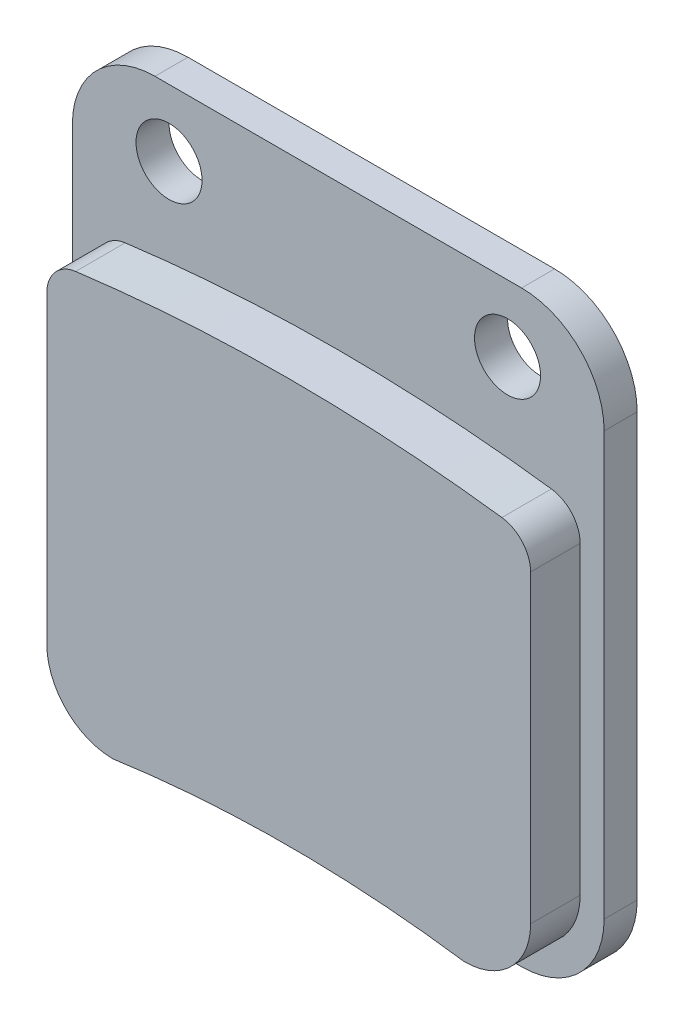
ISO-10303-21;
HEADER;
FILE_DESCRIPTION(('STEP AP214'),'2;1');
FILE_NAME('part.step','',(''),(''),'','','');
FILE_SCHEMA(('AUTOMOTIVE_DESIGN { 1 0 10303 214 1 1 1 1 }'));
ENDSEC;
DATA;
#1=APPLICATION_CONTEXT('core data for automotive mechanical design processes');
#2=APPLICATION_PROTOCOL_DEFINITION('international standard','automotive_design',2000,#1);
#3=PRODUCT_CONTEXT('',#1,'mechanical');
#4=PRODUCT('Part','Part','',(#3));
#5=PRODUCT_RELATED_PRODUCT_CATEGORY('part','',(#4));
#6=PRODUCT_DEFINITION_FORMATION('','',#4);
#7=PRODUCT_DEFINITION_CONTEXT('part definition',#1,'design');
#8=PRODUCT_DEFINITION('design','',#6,#7);
#9=PRODUCT_DEFINITION_SHAPE('','',#8);
#10=(LENGTH_UNIT() NAMED_UNIT(*) SI_UNIT(.MILLI.,.METRE.));
#11=(NAMED_UNIT(*) PLANE_ANGLE_UNIT() SI_UNIT($,.RADIAN.));
#12=(NAMED_UNIT(*) SI_UNIT($,.STERADIAN.) SOLID_ANGLE_UNIT());
#13=UNCERTAINTY_MEASURE_WITH_UNIT(LENGTH_MEASURE(1.E-05),#10,'distance_accuracy_value','');
#14=(GEOMETRIC_REPRESENTATION_CONTEXT(3) GLOBAL_UNCERTAINTY_ASSIGNED_CONTEXT((#13)) GLOBAL_UNIT_ASSIGNED_CONTEXT((#10,
#11,#12)) REPRESENTATION_CONTEXT('',''));
#15=CARTESIAN_POINT('',(0.,0.,0.));
#16=DIRECTION('',(0.,0.,1.));
#17=DIRECTION('',(1.,0.,0.));
#18=AXIS2_PLACEMENT_3D('',#15,#16,#17);
#19=CARTESIAN_POINT('',(-14.097,-16.256,2.54));
#20=DIRECTION('',(0.,0.,-1.));
#21=DIRECTION('',(-1.,0.,0.));
#22=AXIS2_PLACEMENT_3D('',#19,#20,#21);
#23=PLANE('',#22);
#24=CARTESIAN_POINT('',(-13.0175,17.4818046875046,2.54));
#25=DIRECTION('',(0.,0.,1.));
#26=DIRECTION('',(1.,0.,0.));
#27=AXIS2_PLACEMENT_3D('',#24,#25,#26);
#28=CIRCLE('',#27,2.54);
#29=CARTESIAN_POINT('',(-10.4775,17.4818046875046,2.54));
#30=VERTEX_POINT('',#29);
#31=EDGE_CURVE('E169',#30,#30,#28,.T.);
#32=ORIENTED_EDGE('',*,*,#31,.F.);
#33=EDGE_LOOP('',(#32));
#34=FACE_BOUND('',#33,.T.);
#35=CARTESIAN_POINT('',(-14.097,-16.256,2.54));
#36=DIRECTION('',(0.,0.,1.));
#37=DIRECTION('',(-1.,0.,0.));
#38=AXIS2_PLACEMENT_3D('',#35,#36,#37);
#39=CIRCLE('',#38,6.35);
#40=CARTESIAN_POINT('',(-20.447,-16.256,2.54));
#41=VERTEX_POINT('',#40);
#42=CARTESIAN_POINT('',(-14.0969999999999,-22.606,2.54));
#43=VERTEX_POINT('',#42);
#44=EDGE_CURVE('E184',#41,#43,#39,.T.);
#45=ORIENTED_EDGE('',*,*,#44,.T.);
#46=DIRECTION('',(1.,0.,0.));
#47=VECTOR('',#46,1.);
#48=CARTESIAN_POINT('',(-14.0969999999999,-22.606,2.54));
#49=LINE('',#48,#47);
#50=CARTESIAN_POINT('',(14.097,-22.606,2.54));
#51=VERTEX_POINT('',#50);
#52=EDGE_CURVE('E187',#43,#51,#49,.T.);
#53=ORIENTED_EDGE('',*,*,#52,.T.);
#54=CARTESIAN_POINT('',(14.097,-16.256,2.54));
#55=DIRECTION('',(0.,0.,1.));
#56=DIRECTION('',(1.,0.,0.));
#57=AXIS2_PLACEMENT_3D('',#54,#55,#56);
#58=CIRCLE('',#57,6.35);
#59=CARTESIAN_POINT('',(20.447,-16.256,2.54));
#60=VERTEX_POINT('',#59);
#61=EDGE_CURVE('E190',#51,#60,#58,.T.);
#62=ORIENTED_EDGE('',*,*,#61,.T.);
#63=DIRECTION('',(0.,1.,0.));
#64=VECTOR('',#63,1.);
#65=CARTESIAN_POINT('',(20.447,-16.256,2.54));
#66=LINE('',#65,#64);
#67=CARTESIAN_POINT('',(20.447,16.256,2.54));
#68=VERTEX_POINT('',#67);
#69=EDGE_CURVE('E192',#60,#68,#66,.T.);
#70=ORIENTED_EDGE('',*,*,#69,.T.);
#71=CARTESIAN_POINT('',(14.097,16.256,2.54));
#72=DIRECTION('',(0.,0.,1.));
#73=DIRECTION('',(-1.,0.,0.));
#74=AXIS2_PLACEMENT_3D('',#71,#72,#73);
#75=CIRCLE('',#74,6.35);
#76=CARTESIAN_POINT('',(14.097,22.606,2.54));
#77=VERTEX_POINT('',#76);
#78=EDGE_CURVE('E194',#68,#77,#75,.T.);
#79=ORIENTED_EDGE('',*,*,#78,.T.);
#80=DIRECTION('',(-1.,0.,0.));
#81=VECTOR('',#80,1.);
#82=CARTESIAN_POINT('',(-14.0969999999999,22.606,2.54));
#83=LINE('',#82,#81);
#84=CARTESIAN_POINT('',(-14.0969999999999,22.606,2.54));
#85=VERTEX_POINT('',#84);
#86=EDGE_CURVE('E196',#77,#85,#83,.T.);
#87=ORIENTED_EDGE('',*,*,#86,.T.);
#88=CARTESIAN_POINT('',(-14.097,16.256,2.54));
#89=DIRECTION('',(0.,0.,1.));
#90=DIRECTION('',(-1.,0.,0.));
#91=AXIS2_PLACEMENT_3D('',#88,#89,#90);
#92=CIRCLE('',#91,6.35);
#93=CARTESIAN_POINT('',(-20.447,16.256,2.54));
#94=VERTEX_POINT('',#93);
#95=EDGE_CURVE('E198',#85,#94,#92,.T.);
#96=ORIENTED_EDGE('',*,*,#95,.T.);
#97=DIRECTION('',(0.,-1.,0.));
#98=VECTOR('',#97,1.);
#99=CARTESIAN_POINT('',(-20.447,-16.256,2.54));
#100=LINE('',#99,#98);
#101=EDGE_CURVE('E200',#94,#41,#100,.T.);
#102=ORIENTED_EDGE('',*,*,#101,.T.);
#103=EDGE_LOOP('',(#45,#53,#62,#70,#79,#87,#96,#102));
#104=FACE_BOUND('',#103,.T.);
#105=CARTESIAN_POINT('',(13.0175,17.4818046875046,2.54));
#106=DIRECTION('',(0.,0.,1.));
#107=DIRECTION('',(1.,0.,0.));
#108=AXIS2_PLACEMENT_3D('',#105,#106,#107);
#109=CIRCLE('',#108,2.54);
#110=CARTESIAN_POINT('',(15.5575,17.4818046875046,2.54));
#111=VERTEX_POINT('',#110);
#112=EDGE_CURVE('E178',#111,#111,#109,.T.);
#113=ORIENTED_EDGE('',*,*,#112,.F.);
#114=EDGE_LOOP('',(#113));
#115=FACE_BOUND('',#114,.T.);
#116=CARTESIAN_POINT('',(16.0633103448276,7.84904901904633,2.54));
#117=DIRECTION('',(0.,0.,1.));
#118=DIRECTION('',(1.,0.,0.));
#119=AXIS2_PLACEMENT_3D('',#116,#117,#118);
#120=CIRCLE('',#119,2.54);
#121=CARTESIAN_POINT('',(18.6033103448276,7.84904901904633,2.54));
#122=VERTEX_POINT('',#121);
#123=CARTESIAN_POINT('',(16.3911330049261,10.3678051214759,2.54));
#124=VERTEX_POINT('',#123);
#125=EDGE_CURVE('E165',#122,#124,#120,.T.);
#126=ORIENTED_EDGE('',*,*,#125,.F.);
#127=DIRECTION('',(0.,1.,0.));
#128=VECTOR('',#127,1.);
#129=CARTESIAN_POINT('',(18.6033103448276,-15.5838231792516,2.54));
#130=LINE('',#129,#128);
#131=CARTESIAN_POINT('',(18.6033103448276,-15.5838231792516,2.54));
#132=VERTEX_POINT('',#131);
#133=EDGE_CURVE('E162',#132,#122,#130,.T.);
#134=ORIENTED_EDGE('',*,*,#133,.F.);
#135=CARTESIAN_POINT('',(13.5233151535376,-15.5768334388359,2.54));
#136=DIRECTION('',(0.,0.,1.));
#137=DIRECTION('',(1.,0.,0.));
#138=AXIS2_PLACEMENT_3D('',#135,#136,#137);
#139=CIRCLE('',#138,5.08);
#140=CARTESIAN_POINT('',(13.4723655362177,-20.6565779340339,2.54));
#141=VERTEX_POINT('',#140);
#142=EDGE_CURVE('E320',#141,#132,#139,.T.);
#143=ORIENTED_EDGE('',*,*,#142,.F.);
#144=CARTESIAN_POINT('',(0.,-115.57,2.54));
#145=DIRECTION('',(0.,0.,-1.));
#146=DIRECTION('',(1.,0.,0.));
#147=AXIS2_PLACEMENT_3D('',#144,#145,#146);
#148=CIRCLE('',#147,95.8648127386356);
#149=CARTESIAN_POINT('',(-13.5233103448276,-20.6638231792516,2.54));
#150=VERTEX_POINT('',#149);
#151=EDGE_CURVE('E354',#150,#141,#148,.T.);
#152=ORIENTED_EDGE('',*,*,#151,.F.);
#153=CARTESIAN_POINT('',(-13.5233103448276,-15.5838231792516,2.54));
#154=DIRECTION('',(0.,0.,1.));
#155=DIRECTION('',(1.,0.,0.));
#156=AXIS2_PLACEMENT_3D('',#153,#154,#155);
#157=CIRCLE('',#156,5.08);
#158=CARTESIAN_POINT('',(-18.6033103448276,-15.5838231792516,2.54));
#159=VERTEX_POINT('',#158);
#160=EDGE_CURVE('E348',#159,#150,#157,.T.);
#161=ORIENTED_EDGE('',*,*,#160,.F.);
#162=DIRECTION('',(0.,-1.,0.));
#163=VECTOR('',#162,1.);
#164=CARTESIAN_POINT('',(-18.6033103448276,-15.5838231792516,2.54));
#165=LINE('',#164,#163);
#166=CARTESIAN_POINT('',(-18.6033103448276,7.84904901904633,2.54));
#167=VERTEX_POINT('',#166);
#168=EDGE_CURVE('E343',#167,#159,#165,.T.);
#169=ORIENTED_EDGE('',*,*,#168,.F.);
#170=CARTESIAN_POINT('',(-16.0633103448276,7.84904901904633,2.54));
#171=DIRECTION('',(0.,0.,1.));
#172=DIRECTION('',(-1.,0.,0.));
#173=AXIS2_PLACEMENT_3D('',#170,#171,#172);
#174=CIRCLE('',#173,2.54);
#175=CARTESIAN_POINT('',(-16.3911330049261,10.3678051214759,2.54));
#176=VERTEX_POINT('',#175);
#177=EDGE_CURVE('E52',#176,#167,#174,.T.);
#178=ORIENTED_EDGE('',*,*,#177,.F.);
#179=CARTESIAN_POINT('',(0.,-115.57,2.54));
#180=DIRECTION('',(0.,0.,1.));
#181=DIRECTION('',(1.,0.,0.));
#182=AXIS2_PLACEMENT_3D('',#179,#180,#181);
#183=CIRCLE('',#182,127.);
#184=EDGE_CURVE('E47',#124,#176,#183,.T.);
#185=ORIENTED_EDGE('',*,*,#184,.F.);
#186=EDGE_LOOP('',(#126,#134,#143,#152,#161,#169,#178,#185));
#187=FACE_BOUND('',#186,.T.);
#188=ADVANCED_FACE('F32',(#34,#104,#115,#187),#23,.F.);
#189=CARTESIAN_POINT('',(-14.097,-16.256,0.));
#190=DIRECTION('',(0.,0.,-1.));
#191=DIRECTION('',(-1.,0.,0.));
#192=AXIS2_PLACEMENT_3D('',#189,#190,#191);
#193=PLANE('',#192);
#194=CARTESIAN_POINT('',(13.0175,17.4818046875046,0.));
#195=DIRECTION('',(0.,0.,1.));
#196=DIRECTION('',(1.,0.,0.));
#197=AXIS2_PLACEMENT_3D('',#194,#195,#196);
#198=CIRCLE('',#197,2.54);
#199=CARTESIAN_POINT('',(15.5575,17.4818046875046,0.));
#200=VERTEX_POINT('',#199);
#201=EDGE_CURVE('E176',#200,#200,#198,.T.);
#202=ORIENTED_EDGE('',*,*,#201,.T.);
#203=EDGE_LOOP('',(#202));
#204=FACE_BOUND('',#203,.T.);
#205=CARTESIAN_POINT('',(-14.097,-16.256,0.));
#206=DIRECTION('',(0.,0.,1.));
#207=DIRECTION('',(-1.,0.,0.));
#208=AXIS2_PLACEMENT_3D('',#205,#206,#207);
#209=CIRCLE('',#208,6.35);
#210=CARTESIAN_POINT('',(-20.447,-16.256,0.));
#211=VERTEX_POINT('',#210);
#212=CARTESIAN_POINT('',(-14.0969999999999,-22.606,0.));
#213=VERTEX_POINT('',#212);
#214=EDGE_CURVE('E181',#211,#213,#209,.T.);
#215=ORIENTED_EDGE('',*,*,#214,.F.);
#216=DIRECTION('',(0.,-1.,0.));
#217=VECTOR('',#216,1.);
#218=CARTESIAN_POINT('',(-20.447,-16.256,0.));
#219=LINE('',#218,#217);
#220=CARTESIAN_POINT('',(-20.447,16.256,0.));
#221=VERTEX_POINT('',#220);
#222=EDGE_CURVE('E188',#221,#211,#219,.T.);
#223=ORIENTED_EDGE('',*,*,#222,.F.);
#224=CARTESIAN_POINT('',(-14.097,16.256,0.));
#225=DIRECTION('',(0.,0.,1.));
#226=DIRECTION('',(-1.,0.,0.));
#227=AXIS2_PLACEMENT_3D('',#224,#225,#226);
#228=CIRCLE('',#227,6.35);
#229=CARTESIAN_POINT('',(-14.0969999999999,22.606,0.));
#230=VERTEX_POINT('',#229);
#231=EDGE_CURVE('E215',#230,#221,#228,.T.);
#232=ORIENTED_EDGE('',*,*,#231,.F.);
#233=DIRECTION('',(-1.,0.,0.));
#234=VECTOR('',#233,1.);
#235=CARTESIAN_POINT('',(-14.0969999999999,22.606,0.));
#236=LINE('',#235,#234);
#237=CARTESIAN_POINT('',(14.097,22.606,0.));
#238=VERTEX_POINT('',#237);
#239=EDGE_CURVE('E213',#238,#230,#236,.T.);
#240=ORIENTED_EDGE('',*,*,#239,.F.);
#241=CARTESIAN_POINT('',(14.097,16.256,0.));
#242=DIRECTION('',(0.,0.,1.));
#243=DIRECTION('',(-1.,0.,0.));
#244=AXIS2_PLACEMENT_3D('',#241,#242,#243);
#245=CIRCLE('',#244,6.35);
#246=CARTESIAN_POINT('',(20.447,16.256,0.));
#247=VERTEX_POINT('',#246);
#248=EDGE_CURVE('E211',#247,#238,#245,.T.);
#249=ORIENTED_EDGE('',*,*,#248,.F.);
#250=DIRECTION('',(0.,1.,0.));
#251=VECTOR('',#250,1.);
#252=CARTESIAN_POINT('',(20.447,-16.256,0.));
#253=LINE('',#252,#251);
#254=CARTESIAN_POINT('',(20.447,-16.256,0.));
#255=VERTEX_POINT('',#254);
#256=EDGE_CURVE('E209',#255,#247,#253,.T.);
#257=ORIENTED_EDGE('',*,*,#256,.F.);
#258=CARTESIAN_POINT('',(14.097,-16.256,0.));
#259=DIRECTION('',(0.,0.,1.));
#260=DIRECTION('',(1.,0.,0.));
#261=AXIS2_PLACEMENT_3D('',#258,#259,#260);
#262=CIRCLE('',#261,6.35);
#263=CARTESIAN_POINT('',(14.097,-22.606,0.));
#264=VERTEX_POINT('',#263);
#265=EDGE_CURVE('E207',#264,#255,#262,.T.);
#266=ORIENTED_EDGE('',*,*,#265,.F.);
#267=DIRECTION('',(1.,0.,0.));
#268=VECTOR('',#267,1.);
#269=CARTESIAN_POINT('',(-14.0969999999999,-22.606,0.));
#270=LINE('',#269,#268);
#271=EDGE_CURVE('E205',#213,#264,#270,.T.);
#272=ORIENTED_EDGE('',*,*,#271,.F.);
#273=EDGE_LOOP('',(#215,#223,#232,#240,#249,#257,#266,#272));
#274=FACE_BOUND('',#273,.T.);
#275=CARTESIAN_POINT('',(-13.0175,17.4818046875046,0.));
#276=DIRECTION('',(0.,0.,1.));
#277=DIRECTION('',(1.,0.,0.));
#278=AXIS2_PLACEMENT_3D('',#275,#276,#277);
#279=CIRCLE('',#278,2.54);
#280=CARTESIAN_POINT('',(-10.4775,17.4818046875046,0.));
#281=VERTEX_POINT('',#280);
#282=EDGE_CURVE('E166',#281,#281,#279,.T.);
#283=ORIENTED_EDGE('',*,*,#282,.T.);
#284=EDGE_LOOP('',(#283));
#285=FACE_BOUND('',#284,.T.);
#286=ADVANCED_FACE('F245',(#204,#274,#285),#193,.T.);
#287=CARTESIAN_POINT('',(-14.097,-16.256,2.54));
#288=DIRECTION('',(0.,0.,-1.));
#289=DIRECTION('',(-1.,0.,0.));
#290=AXIS2_PLACEMENT_3D('',#287,#288,#289);
#291=CYLINDRICAL_SURFACE('',#290,6.35);
#292=ORIENTED_EDGE('',*,*,#214,.T.);
#293=DIRECTION('',(0.,0.,-1.));
#294=VECTOR('',#293,1.);
#295=CARTESIAN_POINT('',(-14.0969999999999,-22.606,2.54));
#296=LINE('',#295,#294);
#297=EDGE_CURVE('E11',#43,#213,#296,.T.);
#298=ORIENTED_EDGE('',*,*,#297,.F.);
#299=ORIENTED_EDGE('',*,*,#44,.F.);
#300=DIRECTION('',(0.,0.,-1.));
#301=VECTOR('',#300,1.);
#302=CARTESIAN_POINT('',(-20.447,-16.256,2.54));
#303=LINE('',#302,#301);
#304=EDGE_CURVE('E202',#41,#211,#303,.T.);
#305=ORIENTED_EDGE('',*,*,#304,.T.);
#306=EDGE_LOOP('',(#292,#298,#299,#305));
#307=FACE_BOUND('',#306,.T.);
#308=ADVANCED_FACE('F34',(#307),#291,.T.);
#309=CARTESIAN_POINT('',(-14.0969999999999,-22.606,2.54));
#310=DIRECTION('',(0.,1.,0.));
#311=DIRECTION('',(0.,0.,1.));
#312=AXIS2_PLACEMENT_3D('',#309,#310,#311);
#313=PLANE('',#312);
#314=ORIENTED_EDGE('',*,*,#271,.T.);
#315=DIRECTION('',(0.,0.,-1.));
#316=VECTOR('',#315,1.);
#317=CARTESIAN_POINT('',(14.097,-22.606,2.54));
#318=LINE('',#317,#316);
#319=EDGE_CURVE('E40',#51,#264,#318,.T.);
#320=ORIENTED_EDGE('',*,*,#319,.F.);
#321=ORIENTED_EDGE('',*,*,#52,.F.);
#322=ORIENTED_EDGE('',*,*,#297,.T.);
#323=EDGE_LOOP('',(#314,#320,#321,#322));
#324=FACE_BOUND('',#323,.T.);
#325=ADVANCED_FACE('F263',(#324),#313,.F.);
#326=CARTESIAN_POINT('',(14.097,-16.256,2.54));
#327=DIRECTION('',(0.,0.,-1.));
#328=DIRECTION('',(-1.,0.,0.));
#329=AXIS2_PLACEMENT_3D('',#326,#327,#328);
#330=CYLINDRICAL_SURFACE('',#329,6.35);
#331=ORIENTED_EDGE('',*,*,#265,.T.);
#332=DIRECTION('',(0.,0.,-1.));
#333=VECTOR('',#332,1.);
#334=CARTESIAN_POINT('',(20.447,-16.256,2.54));
#335=LINE('',#334,#333);
#336=EDGE_CURVE('E232',#60,#255,#335,.T.);
#337=ORIENTED_EDGE('',*,*,#336,.F.);
#338=ORIENTED_EDGE('',*,*,#61,.F.);
#339=ORIENTED_EDGE('',*,*,#319,.T.);
#340=EDGE_LOOP('',(#331,#337,#338,#339));
#341=FACE_BOUND('',#340,.T.);
#342=ADVANCED_FACE('F239',(#341),#330,.T.);
#343=CARTESIAN_POINT('',(20.447,-16.256,2.54));
#344=DIRECTION('',(-1.,0.,0.));
#345=DIRECTION('',(0.,0.,1.));
#346=AXIS2_PLACEMENT_3D('',#343,#344,#345);
#347=PLANE('',#346);
#348=ORIENTED_EDGE('',*,*,#256,.T.);
#349=DIRECTION('',(0.,0.,-1.));
#350=VECTOR('',#349,1.);
#351=CARTESIAN_POINT('',(20.447,16.256,2.54));
#352=LINE('',#351,#350);
#353=EDGE_CURVE('E229',#68,#247,#352,.T.);
#354=ORIENTED_EDGE('',*,*,#353,.F.);
#355=ORIENTED_EDGE('',*,*,#69,.F.);
#356=ORIENTED_EDGE('',*,*,#336,.T.);
#357=EDGE_LOOP('',(#348,#354,#355,#356));
#358=FACE_BOUND('',#357,.T.);
#359=ADVANCED_FACE('F251',(#358),#347,.F.);
#360=CARTESIAN_POINT('',(14.097,16.256,2.54));
#361=DIRECTION('',(0.,0.,-1.));
#362=DIRECTION('',(-1.,0.,0.));
#363=AXIS2_PLACEMENT_3D('',#360,#361,#362);
#364=CYLINDRICAL_SURFACE('',#363,6.35);
#365=ORIENTED_EDGE('',*,*,#248,.T.);
#366=DIRECTION('',(0.,0.,-1.));
#367=VECTOR('',#366,1.);
#368=CARTESIAN_POINT('',(14.097,22.606,2.54));
#369=LINE('',#368,#367);
#370=EDGE_CURVE('E226',#77,#238,#369,.T.);
#371=ORIENTED_EDGE('',*,*,#370,.F.);
#372=ORIENTED_EDGE('',*,*,#78,.F.);
#373=ORIENTED_EDGE('',*,*,#353,.T.);
#374=EDGE_LOOP('',(#365,#371,#372,#373));
#375=FACE_BOUND('',#374,.T.);
#376=ADVANCED_FACE('F255',(#375),#364,.T.);
#377=CARTESIAN_POINT('',(-14.0969999999999,22.606,2.54));
#378=DIRECTION('',(0.,-1.,0.));
#379=DIRECTION('',(0.,0.,-1.));
#380=AXIS2_PLACEMENT_3D('',#377,#378,#379);
#381=PLANE('',#380);
#382=ORIENTED_EDGE('',*,*,#239,.T.);
#383=DIRECTION('',(0.,0.,-1.));
#384=VECTOR('',#383,1.);
#385=CARTESIAN_POINT('',(-14.0969999999999,22.606,2.54));
#386=LINE('',#385,#384);
#387=EDGE_CURVE('E223',#85,#230,#386,.T.);
#388=ORIENTED_EDGE('',*,*,#387,.F.);
#389=ORIENTED_EDGE('',*,*,#86,.F.);
#390=ORIENTED_EDGE('',*,*,#370,.T.);
#391=EDGE_LOOP('',(#382,#388,#389,#390));
#392=FACE_BOUND('',#391,.T.);
#393=ADVANCED_FACE('F276',(#392),#381,.F.);
#394=CARTESIAN_POINT('',(-14.097,16.256,2.54));
#395=DIRECTION('',(0.,0.,-1.));
#396=DIRECTION('',(-1.,0.,0.));
#397=AXIS2_PLACEMENT_3D('',#394,#395,#396);
#398=CYLINDRICAL_SURFACE('',#397,6.35);
#399=ORIENTED_EDGE('',*,*,#231,.T.);
#400=DIRECTION('',(0.,0.,-1.));
#401=VECTOR('',#400,1.);
#402=CARTESIAN_POINT('',(-20.447,16.256,2.54));
#403=LINE('',#402,#401);
#404=EDGE_CURVE('E220',#94,#221,#403,.T.);
#405=ORIENTED_EDGE('',*,*,#404,.F.);
#406=ORIENTED_EDGE('',*,*,#95,.F.);
#407=ORIENTED_EDGE('',*,*,#387,.T.);
#408=EDGE_LOOP('',(#399,#405,#406,#407));
#409=FACE_BOUND('',#408,.T.);
#410=ADVANCED_FACE('F274',(#409),#398,.T.);
#411=CARTESIAN_POINT('',(-20.447,-16.256,2.54));
#412=DIRECTION('',(1.,0.,0.));
#413=DIRECTION('',(0.,0.,-1.));
#414=AXIS2_PLACEMENT_3D('',#411,#412,#413);
#415=PLANE('',#414);
#416=ORIENTED_EDGE('',*,*,#222,.T.);
#417=ORIENTED_EDGE('',*,*,#304,.F.);
#418=ORIENTED_EDGE('',*,*,#101,.F.);
#419=ORIENTED_EDGE('',*,*,#404,.T.);
#420=EDGE_LOOP('',(#416,#417,#418,#419));
#421=FACE_BOUND('',#420,.T.);
#422=ADVANCED_FACE('F269',(#421),#415,.F.);
#423=CARTESIAN_POINT('',(13.0175,17.4818046875046,2.54));
#424=DIRECTION('',(0.,0.,-1.));
#425=DIRECTION('',(-1.,0.,0.));
#426=AXIS2_PLACEMENT_3D('',#423,#424,#425);
#427=CYLINDRICAL_SURFACE('',#426,2.54);
#428=ORIENTED_EDGE('',*,*,#112,.T.);
#429=EDGE_LOOP('',(#428));
#430=FACE_BOUND('',#429,.T.);
#431=ORIENTED_EDGE('',*,*,#201,.F.);
#432=EDGE_LOOP('',(#431));
#433=FACE_BOUND('',#432,.T.);
#434=ADVANCED_FACE('F295',(#430,#433),#427,.F.);
#435=CARTESIAN_POINT('',(-13.0175,17.4818046875046,2.54));
#436=DIRECTION('',(0.,0.,-1.));
#437=DIRECTION('',(-1.,0.,0.));
#438=AXIS2_PLACEMENT_3D('',#435,#436,#437);
#439=CYLINDRICAL_SURFACE('',#438,2.54);
#440=ORIENTED_EDGE('',*,*,#31,.T.);
#441=EDGE_LOOP('',(#440));
#442=FACE_BOUND('',#441,.T.);
#443=ORIENTED_EDGE('',*,*,#282,.F.);
#444=EDGE_LOOP('',(#443));
#445=FACE_BOUND('',#444,.T.);
#446=ADVANCED_FACE('F302',(#442,#445),#439,.F.);
#447=CARTESIAN_POINT('',(16.0633103448276,7.84904901904633,6.35));
#448=DIRECTION('',(0.,0.,-1.));
#449=DIRECTION('',(-1.,0.,0.));
#450=AXIS2_PLACEMENT_3D('',#447,#448,#449);
#451=CYLINDRICAL_SURFACE('',#450,2.54);
#452=ORIENTED_EDGE('',*,*,#125,.T.);
#453=DIRECTION('',(0.,0.,-1.));
#454=VECTOR('',#453,1.);
#455=CARTESIAN_POINT('',(16.3911330049261,10.3678051214759,6.35));
#456=LINE('',#455,#454);
#457=CARTESIAN_POINT('',(16.3911330049261,10.3678051214759,6.35));
#458=VERTEX_POINT('',#457);
#459=EDGE_CURVE('E146',#458,#124,#456,.T.);
#460=ORIENTED_EDGE('',*,*,#459,.F.);
#461=CARTESIAN_POINT('',(16.0633103448276,7.84904901904633,6.35));
#462=DIRECTION('',(0.,0.,1.));
#463=DIRECTION('',(1.,0.,0.));
#464=AXIS2_PLACEMENT_3D('',#461,#462,#463);
#465=CIRCLE('',#464,2.54);
#466=CARTESIAN_POINT('',(18.6033103448276,7.84904901904633,6.35));
#467=VERTEX_POINT('',#466);
#468=EDGE_CURVE('E153',#467,#458,#465,.T.);
#469=ORIENTED_EDGE('',*,*,#468,.F.);
#470=DIRECTION('',(0.,0.,-1.));
#471=VECTOR('',#470,1.);
#472=CARTESIAN_POINT('',(18.6033103448276,7.84904901904633,6.35));
#473=LINE('',#472,#471);
#474=EDGE_CURVE('E317',#467,#122,#473,.T.);
#475=ORIENTED_EDGE('',*,*,#474,.T.);
#476=EDGE_LOOP('',(#452,#460,#469,#475));
#477=FACE_BOUND('',#476,.T.);
#478=ADVANCED_FACE('F164',(#477),#451,.T.);
#479=CARTESIAN_POINT('',(0.,-115.57,6.35));
#480=DIRECTION('',(0.,0.,-1.));
#481=DIRECTION('',(-1.,0.,0.));
#482=AXIS2_PLACEMENT_3D('',#479,#480,#481);
#483=CYLINDRICAL_SURFACE('',#482,127.);
#484=ORIENTED_EDGE('',*,*,#184,.T.);
#485=DIRECTION('',(0.,0.,-1.));
#486=VECTOR('',#485,1.);
#487=CARTESIAN_POINT('',(-16.3911330049261,10.3678051214759,6.35));
#488=LINE('',#487,#486);
#489=CARTESIAN_POINT('',(-16.3911330049261,10.3678051214759,6.35));
#490=VERTEX_POINT('',#489);
#491=EDGE_CURVE('E149',#490,#176,#488,.T.);
#492=ORIENTED_EDGE('',*,*,#491,.F.);
#493=CARTESIAN_POINT('',(0.,-115.57,6.35));
#494=DIRECTION('',(0.,0.,1.));
#495=DIRECTION('',(1.,0.,0.));
#496=AXIS2_PLACEMENT_3D('',#493,#494,#495);
#497=CIRCLE('',#496,127.);
#498=EDGE_CURVE('E142',#458,#490,#497,.T.);
#499=ORIENTED_EDGE('',*,*,#498,.F.);
#500=ORIENTED_EDGE('',*,*,#459,.T.);
#501=EDGE_LOOP('',(#484,#492,#499,#500));
#502=FACE_BOUND('',#501,.T.);
#503=ADVANCED_FACE('F144',(#502),#483,.T.);
#504=CARTESIAN_POINT('',(-16.0633103448276,7.84904901904633,6.35));
#505=DIRECTION('',(0.,0.,-1.));
#506=DIRECTION('',(-1.,0.,0.));
#507=AXIS2_PLACEMENT_3D('',#504,#505,#506);
#508=CYLINDRICAL_SURFACE('',#507,2.54);
#509=ORIENTED_EDGE('',*,*,#177,.T.);
#510=DIRECTION('',(0.,0.,-1.));
#511=VECTOR('',#510,1.);
#512=CARTESIAN_POINT('',(-18.6033103448276,7.84904901904633,6.35));
#513=LINE('',#512,#511);
#514=CARTESIAN_POINT('',(-18.6033103448276,7.84904901904633,6.35));
#515=VERTEX_POINT('',#514);
#516=EDGE_CURVE('E171',#515,#167,#513,.T.);
#517=ORIENTED_EDGE('',*,*,#516,.F.);
#518=CARTESIAN_POINT('',(-16.0633103448276,7.84904901904633,6.35));
#519=DIRECTION('',(0.,0.,1.));
#520=DIRECTION('',(-1.,0.,0.));
#521=AXIS2_PLACEMENT_3D('',#518,#519,#520);
#522=CIRCLE('',#521,2.54);
#523=EDGE_CURVE('E152',#490,#515,#522,.T.);
#524=ORIENTED_EDGE('',*,*,#523,.F.);
#525=ORIENTED_EDGE('',*,*,#491,.T.);
#526=EDGE_LOOP('',(#509,#517,#524,#525));
#527=FACE_BOUND('',#526,.T.);
#528=ADVANCED_FACE('F346',(#527),#508,.T.);
#529=CARTESIAN_POINT('',(-18.6033103448276,-15.5838231792516,6.35));
#530=DIRECTION('',(1.,0.,0.));
#531=DIRECTION('',(0.,1.,0.));
#532=AXIS2_PLACEMENT_3D('',#529,#530,#531);
#533=PLANE('',#532);
#534=ORIENTED_EDGE('',*,*,#168,.T.);
#535=DIRECTION('',(0.,0.,-1.));
#536=VECTOR('',#535,1.);
#537=CARTESIAN_POINT('',(-18.6033103448276,-15.5838231792516,6.35));
#538=LINE('',#537,#536);
#539=CARTESIAN_POINT('',(-18.6033103448276,-15.5838231792516,6.35));
#540=VERTEX_POINT('',#539);
#541=EDGE_CURVE('E334',#540,#159,#538,.T.);
#542=ORIENTED_EDGE('',*,*,#541,.F.);
#543=DIRECTION('',(0.,-1.,0.));
#544=VECTOR('',#543,1.);
#545=CARTESIAN_POINT('',(-18.6033103448276,-15.5838231792516,6.35));
#546=LINE('',#545,#544);
#547=EDGE_CURVE('E344',#515,#540,#546,.T.);
#548=ORIENTED_EDGE('',*,*,#547,.F.);
#549=ORIENTED_EDGE('',*,*,#516,.T.);
#550=EDGE_LOOP('',(#534,#542,#548,#549));
#551=FACE_BOUND('',#550,.T.);
#552=ADVANCED_FACE('F341',(#551),#533,.F.);
#553=CARTESIAN_POINT('',(-13.5233103448276,-15.5838231792516,6.35));
#554=DIRECTION('',(0.,0.,-1.));
#555=DIRECTION('',(-1.,0.,0.));
#556=AXIS2_PLACEMENT_3D('',#553,#554,#555);
#557=CYLINDRICAL_SURFACE('',#556,5.08);
#558=ORIENTED_EDGE('',*,*,#160,.T.);
#559=DIRECTION('',(0.,0.,-1.));
#560=VECTOR('',#559,1.);
#561=CARTESIAN_POINT('',(-13.5233103448276,-20.6638231792516,6.35));
#562=LINE('',#561,#560);
#563=CARTESIAN_POINT('',(-13.5233103448276,-20.6638231792516,6.35));
#564=VERTEX_POINT('',#563);
#565=EDGE_CURVE('E331',#564,#150,#562,.T.);
#566=ORIENTED_EDGE('',*,*,#565,.F.);
#567=CARTESIAN_POINT('',(-13.5233103448276,-15.5838231792516,6.35));
#568=DIRECTION('',(0.,0.,1.));
#569=DIRECTION('',(1.,0.,0.));
#570=AXIS2_PLACEMENT_3D('',#567,#568,#569);
#571=CIRCLE('',#570,5.08);
#572=EDGE_CURVE('E368',#540,#564,#571,.T.);
#573=ORIENTED_EDGE('',*,*,#572,.F.);
#574=ORIENTED_EDGE('',*,*,#541,.T.);
#575=EDGE_LOOP('',(#558,#566,#573,#574));
#576=FACE_BOUND('',#575,.T.);
#577=ADVANCED_FACE('F367',(#576),#557,.T.);
#578=CARTESIAN_POINT('',(0.,-115.57,6.35));
#579=DIRECTION('',(0.,0.,-1.));
#580=DIRECTION('',(-1.,0.,0.));
#581=AXIS2_PLACEMENT_3D('',#578,#579,#580);
#582=CYLINDRICAL_SURFACE('',#581,95.8648127386356);
#583=ORIENTED_EDGE('',*,*,#151,.T.);
#584=DIRECTION('',(0.,0.,-1.));
#585=VECTOR('',#584,1.);
#586=CARTESIAN_POINT('',(13.4723655362177,-20.6565779340339,6.35));
#587=LINE('',#586,#585);
#588=CARTESIAN_POINT('',(13.4723655362177,-20.6565779340339,6.35));
#589=VERTEX_POINT('',#588);
#590=EDGE_CURVE('E323',#589,#141,#587,.T.);
#591=ORIENTED_EDGE('',*,*,#590,.F.);
#592=CARTESIAN_POINT('',(0.,-115.57,6.35));
#593=DIRECTION('',(0.,0.,-1.));
#594=DIRECTION('',(1.,0.,0.));
#595=AXIS2_PLACEMENT_3D('',#592,#593,#594);
#596=CIRCLE('',#595,95.8648127386356);
#597=EDGE_CURVE('E364',#564,#589,#596,.T.);
#598=ORIENTED_EDGE('',*,*,#597,.F.);
#599=ORIENTED_EDGE('',*,*,#565,.T.);
#600=EDGE_LOOP('',(#583,#591,#598,#599));
#601=FACE_BOUND('',#600,.T.);
#602=ADVANCED_FACE('F361',(#601),#582,.F.);
#603=CARTESIAN_POINT('',(13.5233151535376,-15.5768334388359,6.35));
#604=DIRECTION('',(0.,0.,-1.));
#605=DIRECTION('',(-1.,0.,0.));
#606=AXIS2_PLACEMENT_3D('',#603,#604,#605);
#607=CYLINDRICAL_SURFACE('',#606,5.08);
#608=ORIENTED_EDGE('',*,*,#142,.T.);
#609=DIRECTION('',(0.,0.,-1.));
#610=VECTOR('',#609,1.);
#611=CARTESIAN_POINT('',(18.6033103448276,-15.5838231792516,6.35));
#612=LINE('',#611,#610);
#613=CARTESIAN_POINT('',(18.6033103448276,-15.5838231792516,6.35));
#614=VERTEX_POINT('',#613);
#615=EDGE_CURVE('E319',#614,#132,#612,.T.);
#616=ORIENTED_EDGE('',*,*,#615,.F.);
#617=CARTESIAN_POINT('',(13.5233151535376,-15.5768334388359,6.35));
#618=DIRECTION('',(0.,0.,1.));
#619=DIRECTION('',(1.,0.,0.));
#620=AXIS2_PLACEMENT_3D('',#617,#618,#619);
#621=CIRCLE('',#620,5.08);
#622=EDGE_CURVE('E325',#589,#614,#621,.T.);
#623=ORIENTED_EDGE('',*,*,#622,.F.);
#624=ORIENTED_EDGE('',*,*,#590,.T.);
#625=EDGE_LOOP('',(#608,#616,#623,#624));
#626=FACE_BOUND('',#625,.T.);
#627=ADVANCED_FACE('F357',(#626),#607,.T.);
#628=CARTESIAN_POINT('',(18.6033103448276,-15.5838231792516,6.35));
#629=DIRECTION('',(-1.,0.,0.));
#630=DIRECTION('',(0.,-1.,0.));
#631=AXIS2_PLACEMENT_3D('',#628,#629,#630);
#632=PLANE('',#631);
#633=ORIENTED_EDGE('',*,*,#133,.T.);
#634=ORIENTED_EDGE('',*,*,#474,.F.);
#635=DIRECTION('',(0.,1.,0.));
#636=VECTOR('',#635,1.);
#637=CARTESIAN_POINT('',(18.6033103448276,-15.5838231792516,6.35));
#638=LINE('',#637,#636);
#639=EDGE_CURVE('E158',#614,#467,#638,.T.);
#640=ORIENTED_EDGE('',*,*,#639,.F.);
#641=ORIENTED_EDGE('',*,*,#615,.T.);
#642=EDGE_LOOP('',(#633,#634,#640,#641));
#643=FACE_BOUND('',#642,.T.);
#644=ADVANCED_FACE('F316',(#643),#632,.F.);
#645=CARTESIAN_POINT('',(16.0633103448276,7.84904901904633,6.35));
#646=DIRECTION('',(0.,0.,1.));
#647=DIRECTION('',(1.,0.,0.));
#648=AXIS2_PLACEMENT_3D('',#645,#646,#647);
#649=PLANE('',#648);
#650=ORIENTED_EDGE('',*,*,#468,.T.);
#651=ORIENTED_EDGE('',*,*,#498,.T.);
#652=ORIENTED_EDGE('',*,*,#523,.T.);
#653=ORIENTED_EDGE('',*,*,#547,.T.);
#654=ORIENTED_EDGE('',*,*,#572,.T.);
#655=ORIENTED_EDGE('',*,*,#597,.T.);
#656=ORIENTED_EDGE('',*,*,#622,.T.);
#657=ORIENTED_EDGE('',*,*,#639,.T.);
#658=EDGE_LOOP('',(#650,#651,#652,#653,#654,#655,#656,#657));
#659=FACE_BOUND('',#658,.T.);
#660=ADVANCED_FACE('F156',(#659),#649,.T.);
#661=CLOSED_SHELL('',(#188,#286,#308,#325,#342,#359,#376,#393,#410,#422,#434,#446,#478,#503,
#528,#552,#577,#602,#627,#644,#660));
#662=MANIFOLD_SOLID_BREP('B2',#661);
#663=ADVANCED_BREP_SHAPE_REPRESENTATION('',(#18,#662),#14);
#664=SHAPE_DEFINITION_REPRESENTATION(#9,#663);
ENDSEC;
END-ISO-10303-21;
